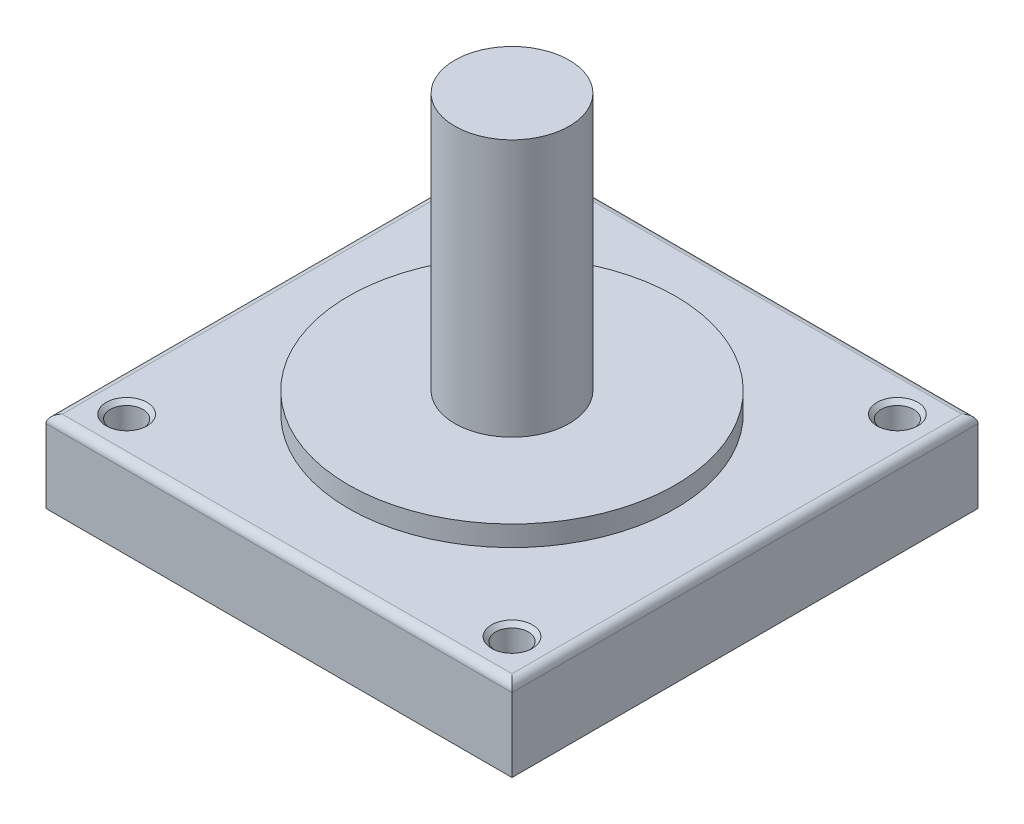
ISO-10303-21;
HEADER;
FILE_DESCRIPTION(('STEP AP214'),'2;1');
FILE_NAME('part.step','',(''),(''),'','','');
FILE_SCHEMA(('AUTOMOTIVE_DESIGN { 1 0 10303 214 1 1 1 1 }'));
ENDSEC;
DATA;
#1=APPLICATION_CONTEXT('core data for automotive mechanical design processes');
#2=APPLICATION_PROTOCOL_DEFINITION('international standard','automotive_design',2000,#1);
#3=PRODUCT_CONTEXT('',#1,'mechanical');
#4=PRODUCT('Part','Part','',(#3));
#5=PRODUCT_RELATED_PRODUCT_CATEGORY('part','',(#4));
#6=PRODUCT_DEFINITION_FORMATION('','',#4);
#7=PRODUCT_DEFINITION_CONTEXT('part definition',#1,'design');
#8=PRODUCT_DEFINITION('design','',#6,#7);
#9=PRODUCT_DEFINITION_SHAPE('','',#8);
#10=(LENGTH_UNIT() NAMED_UNIT(*) SI_UNIT(.MILLI.,.METRE.));
#11=(NAMED_UNIT(*) PLANE_ANGLE_UNIT() SI_UNIT($,.RADIAN.));
#12=(NAMED_UNIT(*) SI_UNIT($,.STERADIAN.) SOLID_ANGLE_UNIT());
#13=UNCERTAINTY_MEASURE_WITH_UNIT(LENGTH_MEASURE(1.E-05),#10,'distance_accuracy_value','');
#14=(GEOMETRIC_REPRESENTATION_CONTEXT(3) GLOBAL_UNCERTAINTY_ASSIGNED_CONTEXT((#13)) GLOBAL_UNIT_ASSIGNED_CONTEXT((#10,
#11,#12)) REPRESENTATION_CONTEXT('',''));
#15=CARTESIAN_POINT('',(0.,0.,0.));
#16=DIRECTION('',(0.,0.,1.));
#17=DIRECTION('',(1.,0.,0.));
#18=AXIS2_PLACEMENT_3D('',#15,#16,#17);
#19=CARTESIAN_POINT('',(0.,56.3,0.));
#20=DIRECTION('',(0.,-1.,0.));
#21=DIRECTION('',(0.,0.,-1.));
#22=AXIS2_PLACEMENT_3D('',#19,#20,#21);
#23=PLANE('',#22);
#24=CARTESIAN_POINT('',(23.5699999999998,56.3,-23.5700000000002));
#25=DIRECTION('',(0.,1.,0.));
#26=DIRECTION('',(-1.,0.,0.));
#27=AXIS2_PLACEMENT_3D('',#24,#25,#26);
#28=CIRCLE('',#27,2.);
#29=CARTESIAN_POINT('',(21.5699999999997,56.3,-23.5700000000002));
#30=VERTEX_POINT('',#29);
#31=EDGE_CURVE('E304',#30,#30,#28,.T.);
#32=ORIENTED_EDGE('',*,*,#31,.T.);
#33=EDGE_LOOP('',(#32));
#34=FACE_BOUND('',#33,.T.);
#35=DIRECTION('',(-1.,0.,0.));
#36=VECTOR('',#35,1.);
#37=CARTESIAN_POINT('',(-28.5,56.3,-28.5));
#38=LINE('',#37,#36);
#39=CARTESIAN_POINT('',(28.5,56.3,-28.5));
#40=VERTEX_POINT('',#39);
#41=CARTESIAN_POINT('',(-28.5,56.3,-28.5));
#42=VERTEX_POINT('',#41);
#43=EDGE_CURVE('E112',#40,#42,#38,.T.);
#44=ORIENTED_EDGE('',*,*,#43,.F.);
#45=DIRECTION('',(0.,0.,-1.));
#46=VECTOR('',#45,1.);
#47=CARTESIAN_POINT('',(28.5,56.3,28.5));
#48=LINE('',#47,#46);
#49=CARTESIAN_POINT('',(28.5,56.3,28.5));
#50=VERTEX_POINT('',#49);
#51=EDGE_CURVE('E104',#50,#40,#48,.T.);
#52=ORIENTED_EDGE('',*,*,#51,.F.);
#53=DIRECTION('',(1.,0.,0.));
#54=VECTOR('',#53,1.);
#55=CARTESIAN_POINT('',(-28.5,56.3,28.5));
#56=LINE('',#55,#54);
#57=CARTESIAN_POINT('',(-28.5,56.3,28.5));
#58=VERTEX_POINT('',#57);
#59=EDGE_CURVE('E119',#58,#50,#56,.T.);
#60=ORIENTED_EDGE('',*,*,#59,.F.);
#61=DIRECTION('',(0.,0.,1.));
#62=VECTOR('',#61,1.);
#63=CARTESIAN_POINT('',(-28.5,56.3,28.5));
#64=LINE('',#63,#62);
#65=EDGE_CURVE('E123',#42,#58,#64,.T.);
#66=ORIENTED_EDGE('',*,*,#65,.F.);
#67=EDGE_LOOP('',(#44,#52,#60,#66));
#68=FACE_BOUND('',#67,.T.);
#69=CARTESIAN_POINT('',(-23.5699999999999,56.3,23.5700000000001));
#70=DIRECTION('',(0.,1.,0.));
#71=DIRECTION('',(1.,0.,0.));
#72=AXIS2_PLACEMENT_3D('',#69,#70,#71);
#73=CIRCLE('',#72,2.);
#74=CARTESIAN_POINT('',(-21.5699999999999,56.3,23.5700000000001));
#75=VERTEX_POINT('',#74);
#76=EDGE_CURVE('E295',#75,#75,#73,.T.);
#77=ORIENTED_EDGE('',*,*,#76,.T.);
#78=EDGE_LOOP('',(#77));
#79=FACE_BOUND('',#78,.T.);
#80=CARTESIAN_POINT('',(-23.57,56.3,-23.57));
#81=DIRECTION('',(0.,1.,0.));
#82=DIRECTION('',(0.,0.,1.));
#83=AXIS2_PLACEMENT_3D('',#80,#81,#82);
#84=CIRCLE('',#83,2.);
#85=CARTESIAN_POINT('',(-23.57,56.3,-21.57));
#86=VERTEX_POINT('',#85);
#87=EDGE_CURVE('E171',#86,#86,#84,.T.);
#88=ORIENTED_EDGE('',*,*,#87,.T.);
#89=EDGE_LOOP('',(#88));
#90=FACE_BOUND('',#89,.T.);
#91=CARTESIAN_POINT('',(23.57,56.3,23.57));
#92=DIRECTION('',(0.,1.,0.));
#93=DIRECTION('',(0.,0.,-1.));
#94=AXIS2_PLACEMENT_3D('',#91,#92,#93);
#95=CIRCLE('',#94,2.);
#96=CARTESIAN_POINT('',(23.57,56.3,21.57));
#97=VERTEX_POINT('',#96);
#98=EDGE_CURVE('E297',#97,#97,#95,.T.);
#99=ORIENTED_EDGE('',*,*,#98,.T.);
#100=EDGE_LOOP('',(#99));
#101=FACE_BOUND('',#100,.T.);
#102=ADVANCED_FACE('F48',(#34,#68,#79,#90,#101),#23,.T.);
#103=CARTESIAN_POINT('',(28.5,56.3,28.5));
#104=DIRECTION('',(1.,0.,0.));
#105=DIRECTION('',(0.,0.,-1.));
#106=AXIS2_PLACEMENT_3D('',#103,#104,#105);
#107=PLANE('',#106);
#108=DIRECTION('',(0.,1.,0.));
#109=VECTOR('',#108,1.);
#110=CARTESIAN_POINT('',(28.5,56.3,-28.5));
#111=LINE('',#110,#109);
#112=CARTESIAN_POINT('',(28.5,65.3,-28.5));
#113=VERTEX_POINT('',#112);
#114=EDGE_CURVE('E106',#40,#113,#111,.T.);
#115=ORIENTED_EDGE('',*,*,#114,.T.);
#116=DIRECTION('',(0.,0.,-1.));
#117=VECTOR('',#116,1.);
#118=CARTESIAN_POINT('',(28.5,65.3,28.5));
#119=LINE('',#118,#117);
#120=CARTESIAN_POINT('',(28.5,65.3,28.5));
#121=VERTEX_POINT('',#120);
#122=EDGE_CURVE('E65',#113,#121,#119,.F.);
#123=ORIENTED_EDGE('',*,*,#122,.T.);
#124=DIRECTION('',(0.,1.,0.));
#125=VECTOR('',#124,1.);
#126=CARTESIAN_POINT('',(28.5,56.3,28.5));
#127=LINE('',#126,#125);
#128=EDGE_CURVE('E107',#50,#121,#127,.T.);
#129=ORIENTED_EDGE('',*,*,#128,.F.);
#130=ORIENTED_EDGE('',*,*,#51,.T.);
#131=EDGE_LOOP('',(#115,#123,#129,#130));
#132=FACE_BOUND('',#131,.T.);
#133=ADVANCED_FACE('F105',(#132),#107,.T.);
#134=CARTESIAN_POINT('',(-28.5,56.3,28.5));
#135=DIRECTION('',(0.,0.,1.));
#136=DIRECTION('',(1.,0.,0.));
#137=AXIS2_PLACEMENT_3D('',#134,#135,#136);
#138=PLANE('',#137);
#139=ORIENTED_EDGE('',*,*,#128,.T.);
#140=DIRECTION('',(1.,0.,0.));
#141=VECTOR('',#140,1.);
#142=CARTESIAN_POINT('',(-28.5,65.3,28.5));
#143=LINE('',#142,#141);
#144=CARTESIAN_POINT('',(-28.5,65.3,28.5));
#145=VERTEX_POINT('',#144);
#146=EDGE_CURVE('E163',#121,#145,#143,.F.);
#147=ORIENTED_EDGE('',*,*,#146,.T.);
#148=DIRECTION('',(0.,1.,0.));
#149=VECTOR('',#148,1.);
#150=CARTESIAN_POINT('',(-28.5,56.3,28.5));
#151=LINE('',#150,#149);
#152=EDGE_CURVE('E135',#58,#145,#151,.T.);
#153=ORIENTED_EDGE('',*,*,#152,.F.);
#154=ORIENTED_EDGE('',*,*,#59,.T.);
#155=EDGE_LOOP('',(#139,#147,#153,#154));
#156=FACE_BOUND('',#155,.T.);
#157=ADVANCED_FACE('F227',(#156),#138,.T.);
#158=CARTESIAN_POINT('',(-28.5,56.3,28.5));
#159=DIRECTION('',(-1.,0.,0.));
#160=DIRECTION('',(0.,0.,1.));
#161=AXIS2_PLACEMENT_3D('',#158,#159,#160);
#162=PLANE('',#161);
#163=ORIENTED_EDGE('',*,*,#152,.T.);
#164=DIRECTION('',(0.,0.,1.));
#165=VECTOR('',#164,1.);
#166=CARTESIAN_POINT('',(-28.5,65.3,28.5));
#167=LINE('',#166,#165);
#168=CARTESIAN_POINT('',(-28.5,65.3,-28.5));
#169=VERTEX_POINT('',#168);
#170=EDGE_CURVE('E155',#145,#169,#167,.F.);
#171=ORIENTED_EDGE('',*,*,#170,.T.);
#172=DIRECTION('',(0.,1.,0.));
#173=VECTOR('',#172,1.);
#174=CARTESIAN_POINT('',(-28.5,56.3,-28.5));
#175=LINE('',#174,#173);
#176=EDGE_CURVE('E118',#42,#169,#175,.T.);
#177=ORIENTED_EDGE('',*,*,#176,.F.);
#178=ORIENTED_EDGE('',*,*,#65,.T.);
#179=EDGE_LOOP('',(#163,#171,#177,#178));
#180=FACE_BOUND('',#179,.T.);
#181=ADVANCED_FACE('F236',(#180),#162,.T.);
#182=CARTESIAN_POINT('',(-28.5,56.3,-28.5));
#183=DIRECTION('',(0.,0.,-1.));
#184=DIRECTION('',(-1.,0.,0.));
#185=AXIS2_PLACEMENT_3D('',#182,#183,#184);
#186=PLANE('',#185);
#187=ORIENTED_EDGE('',*,*,#176,.T.);
#188=DIRECTION('',(-1.,0.,0.));
#189=VECTOR('',#188,1.);
#190=CARTESIAN_POINT('',(-28.5,65.3,-28.5));
#191=LINE('',#190,#189);
#192=EDGE_CURVE('E73',#169,#113,#191,.F.);
#193=ORIENTED_EDGE('',*,*,#192,.T.);
#194=ORIENTED_EDGE('',*,*,#114,.F.);
#195=ORIENTED_EDGE('',*,*,#43,.T.);
#196=EDGE_LOOP('',(#187,#193,#194,#195));
#197=FACE_BOUND('',#196,.T.);
#198=ADVANCED_FACE('F115',(#197),#186,.T.);
#199=CARTESIAN_POINT('',(0.,66.3,0.));
#200=DIRECTION('',(0.,1.,0.));
#201=DIRECTION('',(0.,0.,1.));
#202=AXIS2_PLACEMENT_3D('',#199,#200,#201);
#203=PLANE('',#202);
#204=CARTESIAN_POINT('',(23.5699999999998,66.3,-23.5700000000002));
#205=DIRECTION('',(0.,1.,0.));
#206=DIRECTION('',(0.,0.,1.));
#207=AXIS2_PLACEMENT_3D('',#204,#205,#206);
#208=CIRCLE('',#207,2.50000000000004);
#209=CARTESIAN_POINT('',(23.5699999999998,66.3,-21.0700000000002));
#210=VERTEX_POINT('',#209);
#211=EDGE_CURVE('E11',#210,#210,#208,.F.);
#212=ORIENTED_EDGE('',*,*,#211,.T.);
#213=EDGE_LOOP('',(#212));
#214=FACE_BOUND('',#213,.T.);
#215=CARTESIAN_POINT('',(23.57,66.3,23.57));
#216=DIRECTION('',(0.,1.,0.));
#217=DIRECTION('',(0.,0.,1.));
#218=AXIS2_PLACEMENT_3D('',#215,#216,#217);
#219=CIRCLE('',#218,2.50000000000004);
#220=CARTESIAN_POINT('',(23.57,66.3,26.07));
#221=VERTEX_POINT('',#220);
#222=EDGE_CURVE('E202',#221,#221,#219,.F.);
#223=ORIENTED_EDGE('',*,*,#222,.T.);
#224=EDGE_LOOP('',(#223));
#225=FACE_BOUND('',#224,.T.);
#226=CARTESIAN_POINT('',(-23.5699999999999,66.3,23.5700000000001));
#227=DIRECTION('',(0.,1.,0.));
#228=DIRECTION('',(0.,0.,1.));
#229=AXIS2_PLACEMENT_3D('',#226,#227,#228);
#230=CIRCLE('',#229,2.50000000000004);
#231=CARTESIAN_POINT('',(-23.5699999999999,66.3,26.0700000000001));
#232=VERTEX_POINT('',#231);
#233=EDGE_CURVE('E194',#232,#232,#230,.F.);
#234=ORIENTED_EDGE('',*,*,#233,.T.);
#235=EDGE_LOOP('',(#234));
#236=FACE_BOUND('',#235,.T.);
#237=CARTESIAN_POINT('',(-23.57,66.3,-23.57));
#238=DIRECTION('',(0.,1.,0.));
#239=DIRECTION('',(0.,0.,1.));
#240=AXIS2_PLACEMENT_3D('',#237,#238,#239);
#241=CIRCLE('',#240,2.50000000000004);
#242=CARTESIAN_POINT('',(-23.57,66.3,-21.07));
#243=VERTEX_POINT('',#242);
#244=EDGE_CURVE('E186',#243,#243,#241,.F.);
#245=ORIENTED_EDGE('',*,*,#244,.T.);
#246=EDGE_LOOP('',(#245));
#247=FACE_BOUND('',#246,.T.);
#248=DIRECTION('',(-1.,0.,0.));
#249=VECTOR('',#248,1.);
#250=CARTESIAN_POINT('',(0.,66.3,-27.5));
#251=LINE('',#250,#249);
#252=CARTESIAN_POINT('',(27.5,66.3,-27.5));
#253=VERTEX_POINT('',#252);
#254=CARTESIAN_POINT('',(-27.5,66.3,-27.5));
#255=VERTEX_POINT('',#254);
#256=EDGE_CURVE('E148',#253,#255,#251,.T.);
#257=ORIENTED_EDGE('',*,*,#256,.T.);
#258=DIRECTION('',(0.,0.,1.));
#259=VECTOR('',#258,1.);
#260=CARTESIAN_POINT('',(-27.5,66.3,0.));
#261=LINE('',#260,#259);
#262=CARTESIAN_POINT('',(-27.5,66.3,27.5));
#263=VERTEX_POINT('',#262);
#264=EDGE_CURVE('E151',#255,#263,#261,.T.);
#265=ORIENTED_EDGE('',*,*,#264,.T.);
#266=DIRECTION('',(1.,0.,0.));
#267=VECTOR('',#266,1.);
#268=CARTESIAN_POINT('',(0.,66.3,27.5));
#269=LINE('',#268,#267);
#270=CARTESIAN_POINT('',(27.5,66.3,27.5));
#271=VERTEX_POINT('',#270);
#272=EDGE_CURVE('E141',#263,#271,#269,.T.);
#273=ORIENTED_EDGE('',*,*,#272,.T.);
#274=DIRECTION('',(0.,0.,-1.));
#275=VECTOR('',#274,1.);
#276=CARTESIAN_POINT('',(27.5,66.3,0.));
#277=LINE('',#276,#275);
#278=EDGE_CURVE('E144',#271,#253,#277,.T.);
#279=ORIENTED_EDGE('',*,*,#278,.T.);
#280=EDGE_LOOP('',(#257,#265,#273,#279));
#281=FACE_BOUND('',#280,.T.);
#282=CARTESIAN_POINT('',(0.,66.3,0.));
#283=DIRECTION('',(0.,1.,0.));
#284=DIRECTION('',(0.,0.,1.));
#285=AXIS2_PLACEMENT_3D('',#282,#283,#284);
#286=CIRCLE('',#285,20.);
#287=CARTESIAN_POINT('',(0.,66.3,20.));
#288=VERTEX_POINT('',#287);
#289=EDGE_CURVE('E134',#288,#288,#286,.T.);
#290=ORIENTED_EDGE('',*,*,#289,.F.);
#291=EDGE_LOOP('',(#290));
#292=FACE_BOUND('',#291,.T.);
#293=ADVANCED_FACE('F242',(#214,#225,#236,#247,#281,#292),#203,.T.);
#294=CARTESIAN_POINT('',(0.,68.8,0.));
#295=DIRECTION('',(0.,-1.,0.));
#296=DIRECTION('',(0.,0.,-1.));
#297=AXIS2_PLACEMENT_3D('',#294,#295,#296);
#298=CYLINDRICAL_SURFACE('',#297,20.);
#299=CARTESIAN_POINT('',(0.,68.8,0.));
#300=DIRECTION('',(0.,1.,0.));
#301=DIRECTION('',(0.,0.,1.));
#302=AXIS2_PLACEMENT_3D('',#299,#300,#301);
#303=CIRCLE('',#302,20.);
#304=CARTESIAN_POINT('',(0.,68.8,20.));
#305=VERTEX_POINT('',#304);
#306=EDGE_CURVE('E113',#305,#305,#303,.T.);
#307=ORIENTED_EDGE('',*,*,#306,.F.);
#308=EDGE_LOOP('',(#307));
#309=FACE_BOUND('',#308,.T.);
#310=ORIENTED_EDGE('',*,*,#289,.T.);
#311=EDGE_LOOP('',(#310));
#312=FACE_BOUND('',#311,.T.);
#313=ADVANCED_FACE('F232',(#309,#312),#298,.T.);
#314=CARTESIAN_POINT('',(0.,68.8,0.));
#315=DIRECTION('',(0.,1.,0.));
#316=DIRECTION('',(0.,0.,1.));
#317=AXIS2_PLACEMENT_3D('',#314,#315,#316);
#318=PLANE('',#317);
#319=CARTESIAN_POINT('',(0.,68.8,0.));
#320=DIRECTION('',(0.,1.,0.));
#321=DIRECTION('',(0.,0.,1.));
#322=AXIS2_PLACEMENT_3D('',#319,#320,#321);
#323=CIRCLE('',#322,7.);
#324=CARTESIAN_POINT('',(0.,68.8,7.));
#325=VERTEX_POINT('',#324);
#326=EDGE_CURVE('E145',#325,#325,#323,.T.);
#327=ORIENTED_EDGE('',*,*,#326,.F.);
#328=EDGE_LOOP('',(#327));
#329=FACE_BOUND('',#328,.T.);
#330=ORIENTED_EDGE('',*,*,#306,.T.);
#331=EDGE_LOOP('',(#330));
#332=FACE_BOUND('',#331,.T.);
#333=ADVANCED_FACE('F323',(#329,#332),#318,.T.);
#334=CARTESIAN_POINT('',(0.,100.3,0.));
#335=DIRECTION('',(0.,-1.,0.));
#336=DIRECTION('',(0.,0.,-1.));
#337=AXIS2_PLACEMENT_3D('',#334,#335,#336);
#338=CYLINDRICAL_SURFACE('',#337,7.);
#339=CARTESIAN_POINT('',(0.,100.3,0.));
#340=DIRECTION('',(0.,1.,0.));
#341=DIRECTION('',(0.,0.,1.));
#342=AXIS2_PLACEMENT_3D('',#339,#340,#341);
#343=CIRCLE('',#342,7.);
#344=CARTESIAN_POINT('',(0.,100.3,7.));
#345=VERTEX_POINT('',#344);
#346=EDGE_CURVE('E182',#345,#345,#343,.T.);
#347=ORIENTED_EDGE('',*,*,#346,.F.);
#348=EDGE_LOOP('',(#347));
#349=FACE_BOUND('',#348,.T.);
#350=ORIENTED_EDGE('',*,*,#326,.T.);
#351=EDGE_LOOP('',(#350));
#352=FACE_BOUND('',#351,.T.);
#353=ADVANCED_FACE('F328',(#349,#352),#338,.T.);
#354=CARTESIAN_POINT('',(0.,100.3,0.));
#355=DIRECTION('',(0.,1.,0.));
#356=DIRECTION('',(0.,0.,1.));
#357=AXIS2_PLACEMENT_3D('',#354,#355,#356);
#358=PLANE('',#357);
#359=ORIENTED_EDGE('',*,*,#346,.T.);
#360=EDGE_LOOP('',(#359));
#361=FACE_BOUND('',#360,.T.);
#362=ADVANCED_FACE('F263',(#361),#358,.T.);
#363=CARTESIAN_POINT('',(27.5,65.3,0.));
#364=DIRECTION('',(0.,0.,-1.));
#365=DIRECTION('',(-1.,0.,0.));
#366=AXIS2_PLACEMENT_3D('',#363,#364,#365);
#367=CYLINDRICAL_SURFACE('',#366,1.);
#368=CARTESIAN_POINT('',(27.5,65.3,27.5));
#369=DIRECTION('',(0.707106781186547,0.,-0.707106781186547));
#370=DIRECTION('',(0.707106781186547,0.,0.707106781186547));
#371=AXIS2_PLACEMENT_3D('',#368,#369,#370);
#372=ELLIPSE('',#371,1.41421356237309,1.);
#373=EDGE_CURVE('E174',#121,#271,#372,.F.);
#374=ORIENTED_EDGE('',*,*,#373,.F.);
#375=ORIENTED_EDGE('',*,*,#122,.F.);
#376=CARTESIAN_POINT('',(27.5,65.3,-27.5));
#377=DIRECTION('',(-0.707106781186547,0.,-0.707106781186547));
#378=DIRECTION('',(0.707106781186547,0.,-0.707106781186547));
#379=AXIS2_PLACEMENT_3D('',#376,#377,#378);
#380=ELLIPSE('',#379,1.41421356237309,1.);
#381=EDGE_CURVE('E178',#253,#113,#380,.T.);
#382=ORIENTED_EDGE('',*,*,#381,.F.);
#383=ORIENTED_EDGE('',*,*,#278,.F.);
#384=EDGE_LOOP('',(#374,#375,#382,#383));
#385=FACE_BOUND('',#384,.T.);
#386=ADVANCED_FACE('F259',(#385),#367,.T.);
#387=CARTESIAN_POINT('',(0.,65.3,-27.5));
#388=DIRECTION('',(-1.,0.,0.));
#389=DIRECTION('',(0.,0.,1.));
#390=AXIS2_PLACEMENT_3D('',#387,#388,#389);
#391=CYLINDRICAL_SURFACE('',#390,1.);
#392=ORIENTED_EDGE('',*,*,#381,.T.);
#393=ORIENTED_EDGE('',*,*,#192,.F.);
#394=CARTESIAN_POINT('',(-27.5,65.3,-27.5));
#395=DIRECTION('',(-0.707106781186547,0.,0.707106781186547));
#396=DIRECTION('',(-0.707106781186547,0.,-0.707106781186547));
#397=AXIS2_PLACEMENT_3D('',#394,#395,#396);
#398=ELLIPSE('',#397,1.41421356237309,1.);
#399=EDGE_CURVE('E170',#255,#169,#398,.T.);
#400=ORIENTED_EDGE('',*,*,#399,.F.);
#401=ORIENTED_EDGE('',*,*,#256,.F.);
#402=EDGE_LOOP('',(#392,#393,#400,#401));
#403=FACE_BOUND('',#402,.T.);
#404=ADVANCED_FACE('F255',(#403),#391,.T.);
#405=CARTESIAN_POINT('',(0.,65.3,27.5));
#406=DIRECTION('',(1.,0.,0.));
#407=DIRECTION('',(0.,0.,-1.));
#408=AXIS2_PLACEMENT_3D('',#405,#406,#407);
#409=CYLINDRICAL_SURFACE('',#408,1.);
#410=ORIENTED_EDGE('',*,*,#373,.T.);
#411=ORIENTED_EDGE('',*,*,#272,.F.);
#412=CARTESIAN_POINT('',(-27.5,65.3,27.5));
#413=DIRECTION('',(0.707106781186547,0.,0.707106781186547));
#414=DIRECTION('',(0.707106781186547,0.,-0.707106781186547));
#415=AXIS2_PLACEMENT_3D('',#412,#413,#414);
#416=ELLIPSE('',#415,1.41421356237309,1.);
#417=EDGE_CURVE('E167',#145,#263,#416,.F.);
#418=ORIENTED_EDGE('',*,*,#417,.F.);
#419=ORIENTED_EDGE('',*,*,#146,.F.);
#420=EDGE_LOOP('',(#410,#411,#418,#419));
#421=FACE_BOUND('',#420,.T.);
#422=ADVANCED_FACE('F251',(#421),#409,.T.);
#423=CARTESIAN_POINT('',(-27.5,65.3,0.));
#424=DIRECTION('',(0.,0.,1.));
#425=DIRECTION('',(1.,0.,0.));
#426=AXIS2_PLACEMENT_3D('',#423,#424,#425);
#427=CYLINDRICAL_SURFACE('',#426,1.);
#428=ORIENTED_EDGE('',*,*,#399,.T.);
#429=ORIENTED_EDGE('',*,*,#170,.F.);
#430=ORIENTED_EDGE('',*,*,#417,.T.);
#431=ORIENTED_EDGE('',*,*,#264,.F.);
#432=EDGE_LOOP('',(#428,#429,#430,#431));
#433=FACE_BOUND('',#432,.T.);
#434=ADVANCED_FACE('F247',(#433),#427,.T.);
#435=CARTESIAN_POINT('',(-23.57,56.3,-23.57));
#436=DIRECTION('',(0.,1.,0.));
#437=DIRECTION('',(0.,0.,1.));
#438=AXIS2_PLACEMENT_3D('',#435,#436,#437);
#439=CYLINDRICAL_SURFACE('',#438,2.);
#440=CARTESIAN_POINT('',(-23.57,65.8,-23.57));
#441=DIRECTION('',(0.,1.,0.));
#442=DIRECTION('',(0.,0.,1.));
#443=AXIS2_PLACEMENT_3D('',#440,#441,#442);
#444=CIRCLE('',#443,2.);
#445=CARTESIAN_POINT('',(-23.57,65.8,-21.57));
#446=VERTEX_POINT('',#445);
#447=EDGE_CURVE('E166',#446,#446,#444,.T.);
#448=ORIENTED_EDGE('',*,*,#447,.T.);
#449=EDGE_LOOP('',(#448));
#450=FACE_BOUND('',#449,.T.);
#451=ORIENTED_EDGE('',*,*,#87,.F.);
#452=EDGE_LOOP('',(#451));
#453=FACE_BOUND('',#452,.T.);
#454=ADVANCED_FACE('F250',(#450,#453),#439,.F.);
#455=CARTESIAN_POINT('',(-23.57,65.8,-23.57));
#456=DIRECTION('',(0.,1.,0.));
#457=DIRECTION('',(0.,0.,1.));
#458=AXIS2_PLACEMENT_3D('',#455,#456,#457);
#459=CONICAL_SURFACE('',#458,2.,0.78539816339746);
#460=ORIENTED_EDGE('',*,*,#244,.F.);
#461=EDGE_LOOP('',(#460));
#462=FACE_BOUND('',#461,.T.);
#463=ORIENTED_EDGE('',*,*,#447,.F.);
#464=EDGE_LOOP('',(#463));
#465=FACE_BOUND('',#464,.T.);
#466=ADVANCED_FACE('F266',(#462,#465),#459,.F.);
#467=CARTESIAN_POINT('',(23.5699999999998,56.3,-23.5700000000002));
#468=DIRECTION('',(0.,1.,0.));
#469=DIRECTION('',(0.,0.,1.));
#470=AXIS2_PLACEMENT_3D('',#467,#468,#469);
#471=CYLINDRICAL_SURFACE('',#470,2.);
#472=CARTESIAN_POINT('',(23.5699999999998,65.8,-23.5700000000002));
#473=DIRECTION('',(0.,1.,0.));
#474=DIRECTION('',(0.,0.,1.));
#475=AXIS2_PLACEMENT_3D('',#472,#473,#474);
#476=CIRCLE('',#475,2.);
#477=CARTESIAN_POINT('',(23.5699999999998,65.8,-21.5700000000002));
#478=VERTEX_POINT('',#477);
#479=EDGE_CURVE('E58',#478,#478,#476,.T.);
#480=ORIENTED_EDGE('',*,*,#479,.T.);
#481=EDGE_LOOP('',(#480));
#482=FACE_BOUND('',#481,.T.);
#483=ORIENTED_EDGE('',*,*,#31,.F.);
#484=EDGE_LOOP('',(#483));
#485=FACE_BOUND('',#484,.T.);
#486=ADVANCED_FACE('F209',(#482,#485),#471,.F.);
#487=CARTESIAN_POINT('',(23.57,56.3,23.57));
#488=DIRECTION('',(0.,1.,0.));
#489=DIRECTION('',(0.,0.,1.));
#490=AXIS2_PLACEMENT_3D('',#487,#488,#489);
#491=CYLINDRICAL_SURFACE('',#490,2.);
#492=CARTESIAN_POINT('',(23.57,65.8,23.57));
#493=DIRECTION('',(0.,1.,0.));
#494=DIRECTION('',(0.,0.,1.));
#495=AXIS2_PLACEMENT_3D('',#492,#493,#494);
#496=CIRCLE('',#495,2.);
#497=CARTESIAN_POINT('',(23.57,65.8,25.57));
#498=VERTEX_POINT('',#497);
#499=EDGE_CURVE('E198',#498,#498,#496,.T.);
#500=ORIENTED_EDGE('',*,*,#499,.T.);
#501=EDGE_LOOP('',(#500));
#502=FACE_BOUND('',#501,.T.);
#503=ORIENTED_EDGE('',*,*,#98,.F.);
#504=EDGE_LOOP('',(#503));
#505=FACE_BOUND('',#504,.T.);
#506=ADVANCED_FACE('F286',(#502,#505),#491,.F.);
#507=CARTESIAN_POINT('',(-23.5699999999999,56.3,23.5700000000001));
#508=DIRECTION('',(0.,1.,0.));
#509=DIRECTION('',(0.,0.,1.));
#510=AXIS2_PLACEMENT_3D('',#507,#508,#509);
#511=CYLINDRICAL_SURFACE('',#510,2.);
#512=CARTESIAN_POINT('',(-23.5699999999999,65.8,23.5700000000001));
#513=DIRECTION('',(0.,1.,0.));
#514=DIRECTION('',(0.,0.,1.));
#515=AXIS2_PLACEMENT_3D('',#512,#513,#514);
#516=CIRCLE('',#515,2.);
#517=CARTESIAN_POINT('',(-23.5699999999999,65.8,25.5700000000001));
#518=VERTEX_POINT('',#517);
#519=EDGE_CURVE('E190',#518,#518,#516,.T.);
#520=ORIENTED_EDGE('',*,*,#519,.T.);
#521=EDGE_LOOP('',(#520));
#522=FACE_BOUND('',#521,.T.);
#523=ORIENTED_EDGE('',*,*,#76,.F.);
#524=EDGE_LOOP('',(#523));
#525=FACE_BOUND('',#524,.T.);
#526=ADVANCED_FACE('F277',(#522,#525),#511,.F.);
#527=CARTESIAN_POINT('',(-23.5699999999999,65.8,23.5700000000001));
#528=DIRECTION('',(0.,1.,0.));
#529=DIRECTION('',(0.,0.,1.));
#530=AXIS2_PLACEMENT_3D('',#527,#528,#529);
#531=CONICAL_SURFACE('',#530,2.,0.78539816339746);
#532=ORIENTED_EDGE('',*,*,#233,.F.);
#533=EDGE_LOOP('',(#532));
#534=FACE_BOUND('',#533,.T.);
#535=ORIENTED_EDGE('',*,*,#519,.F.);
#536=EDGE_LOOP('',(#535));
#537=FACE_BOUND('',#536,.T.);
#538=ADVANCED_FACE('F219',(#534,#537),#531,.F.);
#539=CARTESIAN_POINT('',(23.57,65.8,23.57));
#540=DIRECTION('',(0.,1.,0.));
#541=DIRECTION('',(0.,0.,1.));
#542=AXIS2_PLACEMENT_3D('',#539,#540,#541);
#543=CONICAL_SURFACE('',#542,2.,0.78539816339746);
#544=ORIENTED_EDGE('',*,*,#222,.F.);
#545=EDGE_LOOP('',(#544));
#546=FACE_BOUND('',#545,.T.);
#547=ORIENTED_EDGE('',*,*,#499,.F.);
#548=EDGE_LOOP('',(#547));
#549=FACE_BOUND('',#548,.T.);
#550=ADVANCED_FACE('F213',(#546,#549),#543,.F.);
#551=CARTESIAN_POINT('',(23.5699999999998,65.8,-23.5700000000002));
#552=DIRECTION('',(0.,1.,0.));
#553=DIRECTION('',(0.,0.,1.));
#554=AXIS2_PLACEMENT_3D('',#551,#552,#553);
#555=CONICAL_SURFACE('',#554,2.,0.78539816339746);
#556=ORIENTED_EDGE('',*,*,#211,.F.);
#557=EDGE_LOOP('',(#556));
#558=FACE_BOUND('',#557,.T.);
#559=ORIENTED_EDGE('',*,*,#479,.F.);
#560=EDGE_LOOP('',(#559));
#561=FACE_BOUND('',#560,.T.);
#562=ADVANCED_FACE('F51',(#558,#561),#555,.F.);
#563=CLOSED_SHELL('',(#102,#133,#157,#181,#198,#293,#313,#333,#353,#362,#386,#404,#422,#434,
#454,#466,#486,#506,#526,#538,#550,#562));
#564=MANIFOLD_SOLID_BREP('B2',#563);
#565=ADVANCED_BREP_SHAPE_REPRESENTATION('',(#18,#564),#14);
#566=SHAPE_DEFINITION_REPRESENTATION(#9,#565);
ENDSEC;
END-ISO-10303-21;
